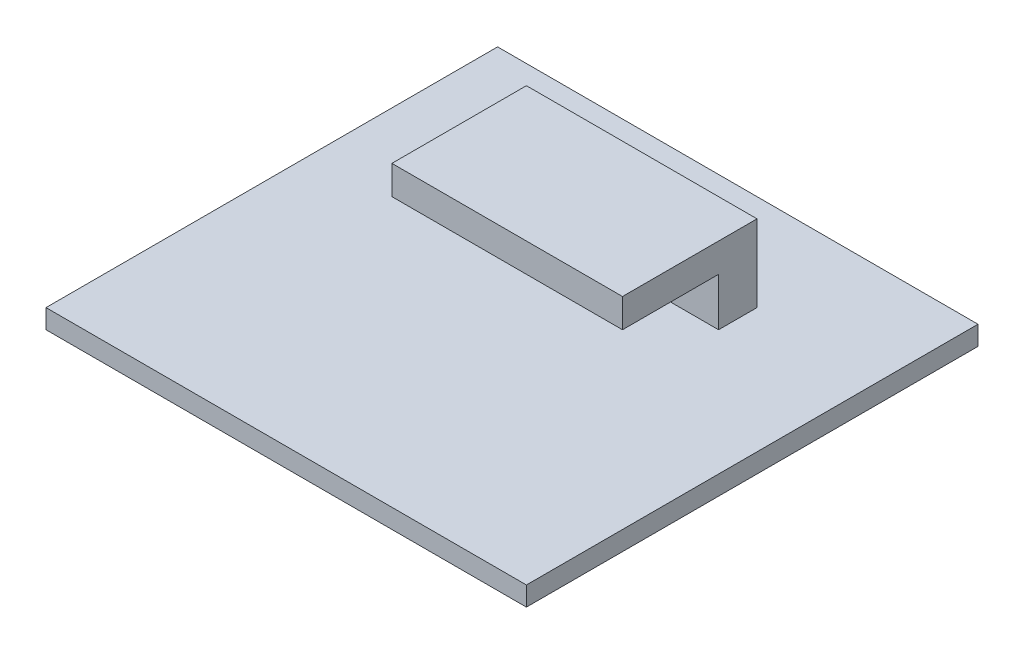
ISO-10303-21;
HEADER;
FILE_DESCRIPTION(('STEP AP214'),'2;1');
FILE_NAME('part.step','',(''),(''),'','','');
FILE_SCHEMA(('AUTOMOTIVE_DESIGN { 1 0 10303 214 1 1 1 1 }'));
ENDSEC;
DATA;
#1=APPLICATION_CONTEXT('core data for automotive mechanical design processes');
#2=APPLICATION_PROTOCOL_DEFINITION('international standard','automotive_design',2000,#1);
#3=PRODUCT_CONTEXT('',#1,'mechanical');
#4=PRODUCT('Part','Part','',(#3));
#5=PRODUCT_RELATED_PRODUCT_CATEGORY('part','',(#4));
#6=PRODUCT_DEFINITION_FORMATION('','',#4);
#7=PRODUCT_DEFINITION_CONTEXT('part definition',#1,'design');
#8=PRODUCT_DEFINITION('design','',#6,#7);
#9=PRODUCT_DEFINITION_SHAPE('','',#8);
#10=(LENGTH_UNIT() NAMED_UNIT(*) SI_UNIT(.MILLI.,.METRE.));
#11=(NAMED_UNIT(*) PLANE_ANGLE_UNIT() SI_UNIT($,.RADIAN.));
#12=(NAMED_UNIT(*) SI_UNIT($,.STERADIAN.) SOLID_ANGLE_UNIT());
#13=UNCERTAINTY_MEASURE_WITH_UNIT(LENGTH_MEASURE(1.E-05),#10,'distance_accuracy_value','');
#14=(GEOMETRIC_REPRESENTATION_CONTEXT(3) GLOBAL_UNCERTAINTY_ASSIGNED_CONTEXT((#13)) GLOBAL_UNIT_ASSIGNED_CONTEXT((#10,
#11,#12)) REPRESENTATION_CONTEXT('',''));
#15=CARTESIAN_POINT('',(0.,0.,0.));
#16=DIRECTION('',(0.,0.,1.));
#17=DIRECTION('',(1.,0.,0.));
#18=AXIS2_PLACEMENT_3D('',#15,#16,#17);
#19=CARTESIAN_POINT('',(13.,10.,-33.));
#20=DIRECTION('',(0.,0.,-1.));
#21=DIRECTION('',(-1.,0.,0.));
#22=AXIS2_PLACEMENT_3D('',#19,#20,#21);
#23=PLANE('',#22);
#24=DIRECTION('',(1.,0.,0.));
#25=VECTOR('',#24,1.);
#26=CARTESIAN_POINT('',(13.,7.,-33.));
#27=LINE('',#26,#25);
#28=CARTESIAN_POINT('',(13.,7.,-33.));
#29=VERTEX_POINT('',#28);
#30=CARTESIAN_POINT('',(37.,7.,-33.));
#31=VERTEX_POINT('',#30);
#32=EDGE_CURVE('E132',#29,#31,#27,.T.);
#33=ORIENTED_EDGE('',*,*,#32,.F.);
#34=DIRECTION('',(0.,-1.,0.));
#35=VECTOR('',#34,1.);
#36=CARTESIAN_POINT('',(13.,10.,-33.));
#37=LINE('',#36,#35);
#38=CARTESIAN_POINT('',(13.,2.,-33.));
#39=VERTEX_POINT('',#38);
#40=EDGE_CURVE('E57',#29,#39,#37,.T.);
#41=ORIENTED_EDGE('',*,*,#40,.T.);
#42=DIRECTION('',(1.,0.,0.));
#43=VECTOR('',#42,1.);
#44=CARTESIAN_POINT('',(13.,2.,-33.));
#45=LINE('',#44,#43);
#46=CARTESIAN_POINT('',(37.,2.,-33.));
#47=VERTEX_POINT('',#46);
#48=EDGE_CURVE('E150',#39,#47,#45,.T.);
#49=ORIENTED_EDGE('',*,*,#48,.T.);
#50=DIRECTION('',(0.,-1.,0.));
#51=VECTOR('',#50,1.);
#52=CARTESIAN_POINT('',(37.,10.,-33.));
#53=LINE('',#52,#51);
#54=EDGE_CURVE('E156',#31,#47,#53,.T.);
#55=ORIENTED_EDGE('',*,*,#54,.F.);
#56=EDGE_LOOP('',(#33,#41,#49,#55));
#57=FACE_BOUND('',#56,.T.);
#58=ADVANCED_FACE('F34',(#57),#23,.F.);
#59=CARTESIAN_POINT('',(0.,2.,0.));
#60=DIRECTION('',(0.,-1.,0.));
#61=DIRECTION('',(0.,0.,-1.));
#62=AXIS2_PLACEMENT_3D('',#59,#60,#61);
#63=PLANE('',#62);
#64=DIRECTION('',(0.,0.,1.));
#65=VECTOR('',#64,1.);
#66=CARTESIAN_POINT('',(0.,2.,0.));
#67=LINE('',#66,#65);
#68=CARTESIAN_POINT('',(0.,2.,-47.));
#69=VERTEX_POINT('',#68);
#70=CARTESIAN_POINT('',(0.,2.,0.));
#71=VERTEX_POINT('',#70);
#72=EDGE_CURVE('E163',#69,#71,#67,.T.);
#73=ORIENTED_EDGE('',*,*,#72,.T.);
#74=DIRECTION('',(1.,0.,0.));
#75=VECTOR('',#74,1.);
#76=CARTESIAN_POINT('',(0.,2.,0.));
#77=LINE('',#76,#75);
#78=CARTESIAN_POINT('',(50.,2.,0.));
#79=VERTEX_POINT('',#78);
#80=EDGE_CURVE('E166',#71,#79,#77,.T.);
#81=ORIENTED_EDGE('',*,*,#80,.T.);
#82=DIRECTION('',(0.,0.,-1.));
#83=VECTOR('',#82,1.);
#84=CARTESIAN_POINT('',(50.,2.,0.));
#85=LINE('',#84,#83);
#86=CARTESIAN_POINT('',(50.,2.,-47.));
#87=VERTEX_POINT('',#86);
#88=EDGE_CURVE('E169',#79,#87,#85,.T.);
#89=ORIENTED_EDGE('',*,*,#88,.T.);
#90=DIRECTION('',(-1.,0.,0.));
#91=VECTOR('',#90,1.);
#92=CARTESIAN_POINT('',(0.,2.,-47.));
#93=LINE('',#92,#91);
#94=EDGE_CURVE('E171',#87,#69,#93,.T.);
#95=ORIENTED_EDGE('',*,*,#94,.T.);
#96=EDGE_LOOP('',(#73,#81,#89,#95));
#97=FACE_BOUND('',#96,.T.);
#98=DIRECTION('',(-1.,0.,0.));
#99=VECTOR('',#98,1.);
#100=CARTESIAN_POINT('',(25.,2.,-37.));
#101=LINE('',#100,#99);
#102=CARTESIAN_POINT('',(37.,2.,-37.));
#103=VERTEX_POINT('',#102);
#104=CARTESIAN_POINT('',(13.,2.,-37.));
#105=VERTEX_POINT('',#104);
#106=EDGE_CURVE('E135',#103,#105,#101,.T.);
#107=ORIENTED_EDGE('',*,*,#106,.F.);
#108=DIRECTION('',(0.,0.,-1.));
#109=VECTOR('',#108,1.);
#110=CARTESIAN_POINT('',(37.,2.,-33.));
#111=LINE('',#110,#109);
#112=EDGE_CURVE('E144',#47,#103,#111,.T.);
#113=ORIENTED_EDGE('',*,*,#112,.F.);
#114=ORIENTED_EDGE('',*,*,#48,.F.);
#115=DIRECTION('',(0.,0.,1.));
#116=VECTOR('',#115,1.);
#117=CARTESIAN_POINT('',(13.,2.,-37.));
#118=LINE('',#117,#116);
#119=EDGE_CURVE('E49',#105,#39,#118,.T.);
#120=ORIENTED_EDGE('',*,*,#119,.F.);
#121=EDGE_LOOP('',(#107,#113,#114,#120));
#122=FACE_BOUND('',#121,.T.);
#123=ADVANCED_FACE('F205',(#97,#122),#63,.F.);
#124=CARTESIAN_POINT('',(0.,2.,0.));
#125=DIRECTION('',(1.,0.,0.));
#126=DIRECTION('',(0.,0.,-1.));
#127=AXIS2_PLACEMENT_3D('',#124,#125,#126);
#128=PLANE('',#127);
#129=DIRECTION('',(0.,0.,1.));
#130=VECTOR('',#129,1.);
#131=CARTESIAN_POINT('',(0.,0.,0.));
#132=LINE('',#131,#130);
#133=CARTESIAN_POINT('',(0.,0.,-47.));
#134=VERTEX_POINT('',#133);
#135=CARTESIAN_POINT('',(0.,0.,0.));
#136=VERTEX_POINT('',#135);
#137=EDGE_CURVE('E162',#134,#136,#132,.T.);
#138=ORIENTED_EDGE('',*,*,#137,.T.);
#139=DIRECTION('',(0.,-1.,0.));
#140=VECTOR('',#139,1.);
#141=CARTESIAN_POINT('',(0.,2.,0.));
#142=LINE('',#141,#140);
#143=EDGE_CURVE('E11',#71,#136,#142,.T.);
#144=ORIENTED_EDGE('',*,*,#143,.F.);
#145=ORIENTED_EDGE('',*,*,#72,.F.);
#146=DIRECTION('',(0.,-1.,0.));
#147=VECTOR('',#146,1.);
#148=CARTESIAN_POINT('',(0.,2.,-47.));
#149=LINE('',#148,#147);
#150=EDGE_CURVE('E173',#69,#134,#149,.T.);
#151=ORIENTED_EDGE('',*,*,#150,.T.);
#152=EDGE_LOOP('',(#138,#144,#145,#151));
#153=FACE_BOUND('',#152,.T.);
#154=ADVANCED_FACE('F36',(#153),#128,.F.);
#155=CARTESIAN_POINT('',(0.,2.,0.));
#156=DIRECTION('',(0.,0.,-1.));
#157=DIRECTION('',(-1.,0.,0.));
#158=AXIS2_PLACEMENT_3D('',#155,#156,#157);
#159=PLANE('',#158);
#160=DIRECTION('',(1.,0.,0.));
#161=VECTOR('',#160,1.);
#162=CARTESIAN_POINT('',(0.,0.,0.));
#163=LINE('',#162,#161);
#164=CARTESIAN_POINT('',(50.,0.,0.));
#165=VERTEX_POINT('',#164);
#166=EDGE_CURVE('E176',#136,#165,#163,.T.);
#167=ORIENTED_EDGE('',*,*,#166,.T.);
#168=DIRECTION('',(0.,-1.,0.));
#169=VECTOR('',#168,1.);
#170=CARTESIAN_POINT('',(50.,2.,0.));
#171=LINE('',#170,#169);
#172=EDGE_CURVE('E42',#79,#165,#171,.T.);
#173=ORIENTED_EDGE('',*,*,#172,.F.);
#174=ORIENTED_EDGE('',*,*,#80,.F.);
#175=ORIENTED_EDGE('',*,*,#143,.T.);
#176=EDGE_LOOP('',(#167,#173,#174,#175));
#177=FACE_BOUND('',#176,.T.);
#178=ADVANCED_FACE('F206',(#177),#159,.F.);
#179=CARTESIAN_POINT('',(50.,2.,0.));
#180=DIRECTION('',(-1.,0.,0.));
#181=DIRECTION('',(0.,0.,1.));
#182=AXIS2_PLACEMENT_3D('',#179,#180,#181);
#183=PLANE('',#182);
#184=DIRECTION('',(0.,0.,-1.));
#185=VECTOR('',#184,1.);
#186=CARTESIAN_POINT('',(50.,0.,0.));
#187=LINE('',#186,#185);
#188=CARTESIAN_POINT('',(50.,0.,-47.));
#189=VERTEX_POINT('',#188);
#190=EDGE_CURVE('E178',#165,#189,#187,.T.);
#191=ORIENTED_EDGE('',*,*,#190,.T.);
#192=DIRECTION('',(0.,-1.,0.));
#193=VECTOR('',#192,1.);
#194=CARTESIAN_POINT('',(50.,2.,-47.));
#195=LINE('',#194,#193);
#196=EDGE_CURVE('E183',#87,#189,#195,.T.);
#197=ORIENTED_EDGE('',*,*,#196,.F.);
#198=ORIENTED_EDGE('',*,*,#88,.F.);
#199=ORIENTED_EDGE('',*,*,#172,.T.);
#200=EDGE_LOOP('',(#191,#197,#198,#199));
#201=FACE_BOUND('',#200,.T.);
#202=ADVANCED_FACE('F190',(#201),#183,.F.);
#203=CARTESIAN_POINT('',(0.,2.,-47.));
#204=DIRECTION('',(0.,0.,1.));
#205=DIRECTION('',(1.,0.,0.));
#206=AXIS2_PLACEMENT_3D('',#203,#204,#205);
#207=PLANE('',#206);
#208=DIRECTION('',(-1.,0.,0.));
#209=VECTOR('',#208,1.);
#210=CARTESIAN_POINT('',(0.,0.,-47.));
#211=LINE('',#210,#209);
#212=EDGE_CURVE('E167',#189,#134,#211,.T.);
#213=ORIENTED_EDGE('',*,*,#212,.T.);
#214=ORIENTED_EDGE('',*,*,#150,.F.);
#215=ORIENTED_EDGE('',*,*,#94,.F.);
#216=ORIENTED_EDGE('',*,*,#196,.T.);
#217=EDGE_LOOP('',(#213,#214,#215,#216));
#218=FACE_BOUND('',#217,.T.);
#219=ADVANCED_FACE('F199',(#218),#207,.F.);
#220=CARTESIAN_POINT('',(0.,0.,0.));
#221=DIRECTION('',(0.,-1.,0.));
#222=DIRECTION('',(0.,0.,-1.));
#223=AXIS2_PLACEMENT_3D('',#220,#221,#222);
#224=PLANE('',#223);
#225=ORIENTED_EDGE('',*,*,#137,.F.);
#226=ORIENTED_EDGE('',*,*,#212,.F.);
#227=ORIENTED_EDGE('',*,*,#190,.F.);
#228=ORIENTED_EDGE('',*,*,#166,.F.);
#229=EDGE_LOOP('',(#225,#226,#227,#228));
#230=FACE_BOUND('',#229,.T.);
#231=ADVANCED_FACE('F196',(#230),#224,.T.);
#232=CARTESIAN_POINT('',(25.,10.,-37.));
#233=DIRECTION('',(0.,0.,1.));
#234=DIRECTION('',(1.,0.,0.));
#235=AXIS2_PLACEMENT_3D('',#232,#233,#234);
#236=PLANE('',#235);
#237=ORIENTED_EDGE('',*,*,#106,.T.);
#238=DIRECTION('',(0.,-1.,0.));
#239=VECTOR('',#238,1.);
#240=CARTESIAN_POINT('',(13.,10.,-37.));
#241=LINE('',#240,#239);
#242=CARTESIAN_POINT('',(13.,10.,-37.));
#243=VERTEX_POINT('',#242);
#244=EDGE_CURVE('E159',#243,#105,#241,.T.);
#245=ORIENTED_EDGE('',*,*,#244,.F.);
#246=DIRECTION('',(-1.,0.,0.));
#247=VECTOR('',#246,1.);
#248=CARTESIAN_POINT('',(37.,10.,-37.));
#249=LINE('',#248,#247);
#250=CARTESIAN_POINT('',(37.,10.,-37.));
#251=VERTEX_POINT('',#250);
#252=EDGE_CURVE('E141',#251,#243,#249,.T.);
#253=ORIENTED_EDGE('',*,*,#252,.F.);
#254=DIRECTION('',(0.,-1.,0.));
#255=VECTOR('',#254,1.);
#256=CARTESIAN_POINT('',(37.,10.,-37.));
#257=LINE('',#256,#255);
#258=EDGE_CURVE('E147',#251,#103,#257,.T.);
#259=ORIENTED_EDGE('',*,*,#258,.T.);
#260=EDGE_LOOP('',(#237,#245,#253,#259));
#261=FACE_BOUND('',#260,.T.);
#262=ADVANCED_FACE('F227',(#261),#236,.F.);
#263=CARTESIAN_POINT('',(13.,10.,-37.));
#264=DIRECTION('',(1.,0.,0.));
#265=DIRECTION('',(0.,0.,-1.));
#266=AXIS2_PLACEMENT_3D('',#263,#264,#265);
#267=PLANE('',#266);
#268=ORIENTED_EDGE('',*,*,#119,.T.);
#269=ORIENTED_EDGE('',*,*,#40,.F.);
#270=DIRECTION('',(0.,0.,-1.));
#271=VECTOR('',#270,1.);
#272=CARTESIAN_POINT('',(13.,7.,-23.));
#273=LINE('',#272,#271);
#274=CARTESIAN_POINT('',(13.,7.,-23.));
#275=VERTEX_POINT('',#274);
#276=EDGE_CURVE('E116',#275,#29,#273,.T.);
#277=ORIENTED_EDGE('',*,*,#276,.F.);
#278=DIRECTION('',(0.,-1.,0.));
#279=VECTOR('',#278,1.);
#280=CARTESIAN_POINT('',(13.,10.,-23.));
#281=LINE('',#280,#279);
#282=CARTESIAN_POINT('',(13.,10.,-23.));
#283=VERTEX_POINT('',#282);
#284=EDGE_CURVE('E123',#283,#275,#281,.T.);
#285=ORIENTED_EDGE('',*,*,#284,.F.);
#286=DIRECTION('',(0.,0.,1.));
#287=VECTOR('',#286,1.);
#288=CARTESIAN_POINT('',(13.,10.,-37.));
#289=LINE('',#288,#287);
#290=EDGE_CURVE('E143',#243,#283,#289,.T.);
#291=ORIENTED_EDGE('',*,*,#290,.F.);
#292=ORIENTED_EDGE('',*,*,#244,.T.);
#293=EDGE_LOOP('',(#268,#269,#277,#285,#291,#292));
#294=FACE_BOUND('',#293,.T.);
#295=ADVANCED_FACE('F134',(#294),#267,.F.);
#296=CARTESIAN_POINT('',(37.,10.,-33.));
#297=DIRECTION('',(-1.,0.,0.));
#298=DIRECTION('',(0.,0.,1.));
#299=AXIS2_PLACEMENT_3D('',#296,#297,#298);
#300=PLANE('',#299);
#301=ORIENTED_EDGE('',*,*,#112,.T.);
#302=ORIENTED_EDGE('',*,*,#258,.F.);
#303=DIRECTION('',(0.,0.,-1.));
#304=VECTOR('',#303,1.);
#305=CARTESIAN_POINT('',(37.,10.,-33.));
#306=LINE('',#305,#304);
#307=CARTESIAN_POINT('',(37.,10.,-23.));
#308=VERTEX_POINT('',#307);
#309=EDGE_CURVE('E146',#308,#251,#306,.T.);
#310=ORIENTED_EDGE('',*,*,#309,.F.);
#311=DIRECTION('',(0.,1.,0.));
#312=VECTOR('',#311,1.);
#313=CARTESIAN_POINT('',(37.,10.,-23.));
#314=LINE('',#313,#312);
#315=CARTESIAN_POINT('',(37.,7.,-23.));
#316=VERTEX_POINT('',#315);
#317=EDGE_CURVE('E122',#316,#308,#314,.T.);
#318=ORIENTED_EDGE('',*,*,#317,.F.);
#319=DIRECTION('',(0.,0.,-1.));
#320=VECTOR('',#319,1.);
#321=CARTESIAN_POINT('',(37.,7.,-23.));
#322=LINE('',#321,#320);
#323=EDGE_CURVE('E118',#316,#31,#322,.T.);
#324=ORIENTED_EDGE('',*,*,#323,.T.);
#325=ORIENTED_EDGE('',*,*,#54,.T.);
#326=EDGE_LOOP('',(#301,#302,#310,#318,#324,#325));
#327=FACE_BOUND('',#326,.T.);
#328=ADVANCED_FACE('F223',(#327),#300,.F.);
#329=CARTESIAN_POINT('',(0.,10.,0.));
#330=DIRECTION('',(0.,1.,0.));
#331=DIRECTION('',(0.,0.,1.));
#332=AXIS2_PLACEMENT_3D('',#329,#330,#331);
#333=PLANE('',#332);
#334=ORIENTED_EDGE('',*,*,#252,.T.);
#335=ORIENTED_EDGE('',*,*,#290,.T.);
#336=DIRECTION('',(-1.,0.,0.));
#337=VECTOR('',#336,1.);
#338=CARTESIAN_POINT('',(13.,10.,-23.));
#339=LINE('',#338,#337);
#340=EDGE_CURVE('E129',#308,#283,#339,.T.);
#341=ORIENTED_EDGE('',*,*,#340,.F.);
#342=ORIENTED_EDGE('',*,*,#309,.T.);
#343=EDGE_LOOP('',(#334,#335,#341,#342));
#344=FACE_BOUND('',#343,.T.);
#345=ADVANCED_FACE('F260',(#344),#333,.T.);
#346=CARTESIAN_POINT('',(13.,7.,-23.));
#347=DIRECTION('',(0.,1.,0.));
#348=DIRECTION('',(0.,0.,1.));
#349=AXIS2_PLACEMENT_3D('',#346,#347,#348);
#350=PLANE('',#349);
#351=ORIENTED_EDGE('',*,*,#32,.T.);
#352=ORIENTED_EDGE('',*,*,#323,.F.);
#353=DIRECTION('',(1.,0.,0.));
#354=VECTOR('',#353,1.);
#355=CARTESIAN_POINT('',(13.,7.,-23.));
#356=LINE('',#355,#354);
#357=EDGE_CURVE('E112',#275,#316,#356,.T.);
#358=ORIENTED_EDGE('',*,*,#357,.F.);
#359=ORIENTED_EDGE('',*,*,#276,.T.);
#360=EDGE_LOOP('',(#351,#352,#358,#359));
#361=FACE_BOUND('',#360,.T.);
#362=ADVANCED_FACE('F114',(#361),#350,.F.);
#363=CARTESIAN_POINT('',(0.,0.,-23.));
#364=DIRECTION('',(0.,0.,1.));
#365=DIRECTION('',(1.,0.,0.));
#366=AXIS2_PLACEMENT_3D('',#363,#364,#365);
#367=PLANE('',#366);
#368=ORIENTED_EDGE('',*,*,#284,.T.);
#369=ORIENTED_EDGE('',*,*,#357,.T.);
#370=ORIENTED_EDGE('',*,*,#317,.T.);
#371=ORIENTED_EDGE('',*,*,#340,.T.);
#372=EDGE_LOOP('',(#368,#369,#370,#371));
#373=FACE_BOUND('',#372,.T.);
#374=ADVANCED_FACE('F127',(#373),#367,.T.);
#375=CLOSED_SHELL('',(#58,#123,#154,#178,#202,#219,#231,#262,#295,#328,#345,#362,#374));
#376=MANIFOLD_SOLID_BREP('B2',#375);
#377=ADVANCED_BREP_SHAPE_REPRESENTATION('',(#18,#376),#14);
#378=SHAPE_DEFINITION_REPRESENTATION(#9,#377);
ENDSEC;
END-ISO-10303-21;
